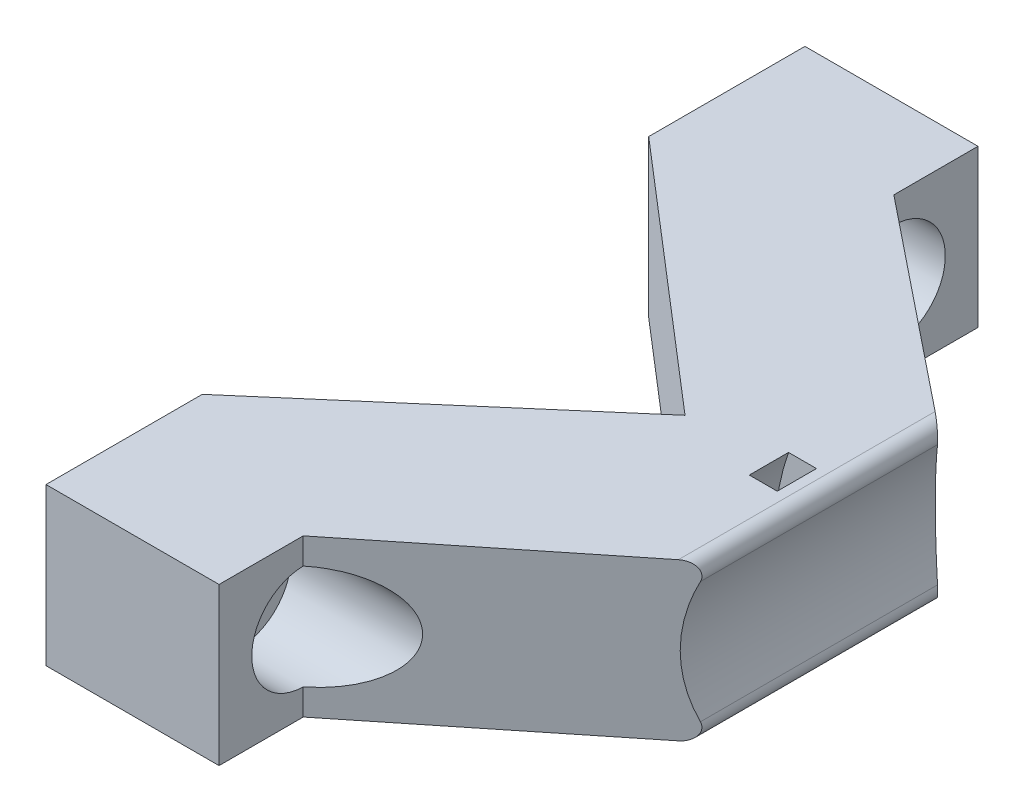
ISO-10303-21;
HEADER;
FILE_DESCRIPTION(('STEP AP214'),'2;1');
FILE_NAME('part.step','',(''),(''),'','','');
FILE_SCHEMA(('AUTOMOTIVE_DESIGN { 1 0 10303 214 1 1 1 1 }'));
ENDSEC;
DATA;
#1=APPLICATION_CONTEXT('core data for automotive mechanical design processes');
#2=APPLICATION_PROTOCOL_DEFINITION('international standard','automotive_design',2000,#1);
#3=PRODUCT_CONTEXT('',#1,'mechanical');
#4=PRODUCT('Part','Part','',(#3));
#5=PRODUCT_RELATED_PRODUCT_CATEGORY('part','',(#4));
#6=PRODUCT_DEFINITION_FORMATION('','',#4);
#7=PRODUCT_DEFINITION_CONTEXT('part definition',#1,'design');
#8=PRODUCT_DEFINITION('design','',#6,#7);
#9=PRODUCT_DEFINITION_SHAPE('','',#8);
#10=(LENGTH_UNIT() NAMED_UNIT(*) SI_UNIT(.MILLI.,.METRE.));
#11=(NAMED_UNIT(*) PLANE_ANGLE_UNIT() SI_UNIT($,.RADIAN.));
#12=(NAMED_UNIT(*) SI_UNIT($,.STERADIAN.) SOLID_ANGLE_UNIT());
#13=UNCERTAINTY_MEASURE_WITH_UNIT(LENGTH_MEASURE(1.E-05),#10,'distance_accuracy_value','');
#14=(GEOMETRIC_REPRESENTATION_CONTEXT(3) GLOBAL_UNCERTAINTY_ASSIGNED_CONTEXT((#13)) GLOBAL_UNIT_ASSIGNED_CONTEXT((#10,
#11,#12)) REPRESENTATION_CONTEXT('',''));
#15=CARTESIAN_POINT('',(0.,0.,0.));
#16=DIRECTION('',(0.,0.,1.));
#17=DIRECTION('',(1.,0.,0.));
#18=AXIS2_PLACEMENT_3D('',#15,#16,#17);
#19=CARTESIAN_POINT('',(106.173207801946,226.349685170106,344.272034703765));
#20=DIRECTION('',(0.,0.,1.));
#21=DIRECTION('',(0.823754471047907,0.566946709513852,0.));
#22=AXIS2_PLACEMENT_3D('',#19,#20,#21);
#23=CYLINDRICAL_SURFACE('',#22,1.);
#24=CARTESIAN_POINT('',(106.173207801946,226.349685170106,376.587161111501));
#25=DIRECTION('',(-0.625547510035263,0.,-0.780186075682387));
#26=DIRECTION('',(0.780186075682387,0.,-0.625547510035263));
#27=AXIS2_PLACEMENT_3D('',#24,#25,#26);
#28=ELLIPSE('',#27,1.28174551067879,1.);
#29=CARTESIAN_POINT('',(106.173207801946,227.349685170106,376.587161111501));
#30=VERTEX_POINT('',#29);
#31=CARTESIAN_POINT('',(107.107257575562,225.992542312963,375.838246809713));
#32=VERTEX_POINT('',#31);
#33=EDGE_CURVE('E11',#30,#32,#28,.T.);
#34=ORIENTED_EDGE('',*,*,#33,.T.);
#35=DIRECTION('',(0.,0.,-1.));
#36=VECTOR('',#35,1.);
#37=CARTESIAN_POINT('',(107.107257575562,225.992542312964,344.272034703765));
#38=LINE('',#37,#36);
#39=CARTESIAN_POINT('',(107.107257575562,225.992542312963,357.705822597817));
#40=VERTEX_POINT('',#39);
#41=EDGE_CURVE('E27',#32,#40,#38,.T.);
#42=ORIENTED_EDGE('',*,*,#41,.T.);
#43=CARTESIAN_POINT('',(106.173207801946,226.349685170106,356.956908296029));
#44=DIRECTION('',(-0.625547510035263,0.,0.780186075682387));
#45=DIRECTION('',(0.780186075682387,0.,0.625547510035263));
#46=AXIS2_PLACEMENT_3D('',#43,#44,#45);
#47=ELLIPSE('',#46,1.28174551067879,1.);
#48=CARTESIAN_POINT('',(106.173207801946,227.349685170106,356.956908296029));
#49=VERTEX_POINT('',#48);
#50=EDGE_CURVE('E318',#40,#49,#47,.T.);
#51=ORIENTED_EDGE('',*,*,#50,.T.);
#52=DIRECTION('',(0.,0.,1.));
#53=VECTOR('',#52,1.);
#54=CARTESIAN_POINT('',(106.173207801946,227.349685170106,344.272034703765));
#55=LINE('',#54,#53);
#56=EDGE_CURVE('E315',#49,#30,#55,.T.);
#57=ORIENTED_EDGE('',*,*,#56,.T.);
#58=EDGE_LOOP('',(#34,#42,#51,#57));
#59=FACE_BOUND('',#58,.T.);
#60=ADVANCED_FACE('F17',(#59),#23,.T.);
#61=CARTESIAN_POINT('',(84.2499060058593,227.349685170106,389.790902709961));
#62=DIRECTION('',(0.,1.,0.));
#63=DIRECTION('',(1.,0.,0.));
#64=AXIS2_PLACEMENT_3D('',#61,#62,#63);
#65=PLANE('',#64);
#66=DIRECTION('',(0.,0.,-1.));
#67=VECTOR('',#66,1.);
#68=CARTESIAN_POINT('',(103.279341884091,227.349685170106,375.272079467773));
#69=LINE('',#68,#67);
#70=CARTESIAN_POINT('',(103.279341884091,227.349685170106,368.272079467773));
#71=VERTEX_POINT('',#70);
#72=CARTESIAN_POINT('',(103.279341884091,227.349685170106,365.272079467773));
#73=VERTEX_POINT('',#72);
#74=EDGE_CURVE('E312',#71,#73,#69,.T.);
#75=ORIENTED_EDGE('',*,*,#74,.T.);
#76=DIRECTION('',(1.,0.,0.));
#77=VECTOR('',#76,1.);
#78=CARTESIAN_POINT('',(102.249905319214,227.349685170106,365.272079467773));
#79=LINE('',#78,#77);
#80=CARTESIAN_POINT('',(105.417507658377,227.349685170106,365.272079467773));
#81=VERTEX_POINT('',#80);
#82=EDGE_CURVE('E309',#73,#81,#79,.T.);
#83=ORIENTED_EDGE('',*,*,#82,.T.);
#84=DIRECTION('',(0.,0.,1.));
#85=VECTOR('',#84,1.);
#86=CARTESIAN_POINT('',(105.417507658377,227.349685170106,360.272079467773));
#87=LINE('',#86,#85);
#88=CARTESIAN_POINT('',(105.417507658377,227.349685170106,368.272079467773));
#89=VERTEX_POINT('',#88);
#90=EDGE_CURVE('E306',#81,#89,#87,.T.);
#91=ORIENTED_EDGE('',*,*,#90,.T.);
#92=DIRECTION('',(-1.,0.,0.));
#93=VECTOR('',#92,1.);
#94=CARTESIAN_POINT('',(102.249905319214,227.349685170106,368.272079467773));
#95=LINE('',#94,#93);
#96=EDGE_CURVE('E304',#89,#71,#95,.T.);
#97=ORIENTED_EDGE('',*,*,#96,.T.);
#98=EDGE_LOOP('',(#75,#83,#91,#97));
#99=FACE_BOUND('',#98,.T.);
#100=ORIENTED_EDGE('',*,*,#56,.F.);
#101=DIRECTION('',(-0.780186075682386,0.,-0.625547510035263));
#102=VECTOR('',#101,1.);
#103=CARTESIAN_POINT('',(103.211273527654,227.349685170106,354.582050979393));
#104=LINE('',#103,#102);
#105=CARTESIAN_POINT('',(90.2499060058594,227.349685170106,344.18972095374));
#106=VERTEX_POINT('',#105);
#107=EDGE_CURVE('E301',#49,#106,#104,.T.);
#108=ORIENTED_EDGE('',*,*,#107,.T.);
#109=DIRECTION('',(0.,0.,-1.));
#110=VECTOR('',#109,1.);
#111=CARTESIAN_POINT('',(90.2499060058593,227.349685170106,367.772057342529));
#112=LINE('',#111,#110);
#113=CARTESIAN_POINT('',(90.2499060058594,227.349685170106,337.753211975098));
#114=VERTEX_POINT('',#113);
#115=EDGE_CURVE('E298',#106,#114,#112,.T.);
#116=ORIENTED_EDGE('',*,*,#115,.T.);
#117=DIRECTION('',(-1.,0.,0.));
#118=VECTOR('',#117,1.);
#119=CARTESIAN_POINT('',(84.9702899169922,227.349685170106,337.753211975098));
#120=LINE('',#119,#118);
#121=CARTESIAN_POINT('',(77.0156779829498,227.349685170106,337.753211975098));
#122=VERTEX_POINT('',#121);
#123=EDGE_CURVE('E295',#114,#122,#120,.T.);
#124=ORIENTED_EDGE('',*,*,#123,.T.);
#125=DIRECTION('',(0.,0.,1.));
#126=VECTOR('',#125,1.);
#127=CARTESIAN_POINT('',(77.0156779829498,227.349685170106,384.272034703765));
#128=LINE('',#127,#126);
#129=CARTESIAN_POINT('',(77.0156779829498,227.349685170106,349.701806461646));
#130=VERTEX_POINT('',#129);
#131=EDGE_CURVE('E290',#122,#130,#128,.T.);
#132=ORIENTED_EDGE('',*,*,#131,.T.);
#133=DIRECTION('',(-0.758183249338418,0.,-0.652041532743612));
#134=VECTOR('',#133,1.);
#135=CARTESIAN_POINT('',(98.9957948588181,227.349685170106,368.604821148572));
#136=LINE('',#135,#134);
#137=CARTESIAN_POINT('',(96.8646607020417,227.349685170106,366.772034703765));
#138=VERTEX_POINT('',#137);
#139=EDGE_CURVE('E212',#138,#130,#136,.T.);
#140=ORIENTED_EDGE('',*,*,#139,.F.);
#141=DIRECTION('',(0.758183249338418,0.,-0.652041532743612));
#142=VECTOR('',#141,1.);
#143=CARTESIAN_POINT('',(87.6160268758223,227.349685170106,374.725907835484));
#144=LINE('',#143,#142);
#145=CARTESIAN_POINT('',(77.0156779829498,227.349685170106,383.842262945884));
#146=VERTEX_POINT('',#145);
#147=EDGE_CURVE('E166',#146,#138,#144,.T.);
#148=ORIENTED_EDGE('',*,*,#147,.F.);
#149=DIRECTION('',(0.,0.,1.));
#150=VECTOR('',#149,1.);
#151=CARTESIAN_POINT('',(77.0156779829498,227.349685170106,372.290902709961));
#152=LINE('',#151,#150);
#153=CARTESIAN_POINT('',(77.0156779829498,227.349685170106,395.790857432433));
#154=VERTEX_POINT('',#153);
#155=EDGE_CURVE('E287',#146,#154,#152,.T.);
#156=ORIENTED_EDGE('',*,*,#155,.T.);
#157=DIRECTION('',(1.,0.,0.));
#158=VECTOR('',#157,1.);
#159=CARTESIAN_POINT('',(84.9702899169922,227.349685170106,395.790857432433));
#160=LINE('',#159,#158);
#161=CARTESIAN_POINT('',(90.2499060058594,227.349685170106,395.790857432433));
#162=VERTEX_POINT('',#161);
#163=EDGE_CURVE('E283',#154,#162,#160,.T.);
#164=ORIENTED_EDGE('',*,*,#163,.T.);
#165=DIRECTION('',(0.,0.,1.));
#166=VECTOR('',#165,1.);
#167=CARTESIAN_POINT('',(90.2499060058594,227.349685170106,388.790880071197));
#168=LINE('',#167,#166);
#169=CARTESIAN_POINT('',(90.2499060058594,227.349685170106,389.35434845379));
#170=VERTEX_POINT('',#169);
#171=EDGE_CURVE('E169',#170,#162,#168,.T.);
#172=ORIENTED_EDGE('',*,*,#171,.F.);
#173=DIRECTION('',(0.780186075682387,0.,-0.625547510035263));
#174=VECTOR('',#173,1.);
#175=CARTESIAN_POINT('',(91.9770656095151,227.349685170106,387.969524469903));
#176=LINE('',#175,#174);
#177=EDGE_CURVE('E280',#170,#30,#176,.T.);
#178=ORIENTED_EDGE('',*,*,#177,.T.);
#179=EDGE_LOOP('',(#100,#108,#116,#124,#132,#140,#148,#156,#164,#172,#178));
#180=FACE_BOUND('',#179,.T.);
#181=ADVANCED_FACE('F331',(#99,#180),#65,.T.);
#182=CARTESIAN_POINT('',(97.5694245376556,221.77793071454,350.058457573036));
#183=DIRECTION('',(-0.625547510035263,0.,0.780186075682387));
#184=DIRECTION('',(0.,1.,0.));
#185=AXIS2_PLACEMENT_3D('',#182,#183,#184);
#186=PLANE('',#185);
#187=ORIENTED_EDGE('',*,*,#50,.F.);
#188=CARTESIAN_POINT('',(119.249904632568,221.349685170106,367.441708521061));
#189=DIRECTION('',(-0.625547510035263,0.,0.780186075682387));
#190=DIRECTION('',(-0.780186075682387,0.,-0.625547510035263));
#191=AXIS2_PLACEMENT_3D('',#188,#189,#190);
#192=ELLIPSE('',#191,16.6626916388242,13.);
#193=CARTESIAN_POINT('',(107.107257575562,216.706828027249,357.705822597817));
#194=VERTEX_POINT('',#193);
#195=EDGE_CURVE('E271',#40,#194,#192,.T.);
#196=ORIENTED_EDGE('',*,*,#195,.T.);
#197=CARTESIAN_POINT('',(106.173207801946,216.349685170106,356.956908296029));
#198=DIRECTION('',(-0.625547510035263,0.,0.780186075682387));
#199=DIRECTION('',(0.780186075682387,0.,0.625547510035263));
#200=AXIS2_PLACEMENT_3D('',#197,#198,#199);
#201=ELLIPSE('',#200,1.28174551067879,1.);
#202=CARTESIAN_POINT('',(106.173207801946,215.349685170106,356.956908296029));
#203=VERTEX_POINT('',#202);
#204=EDGE_CURVE('E264',#203,#194,#201,.T.);
#205=ORIENTED_EDGE('',*,*,#204,.F.);
#206=DIRECTION('',(0.780186075682387,0.,0.625547510035263));
#207=VECTOR('',#206,1.);
#208=CARTESIAN_POINT('',(103.211273527654,215.349685170106,354.582050979393));
#209=LINE('',#208,#207);
#210=CARTESIAN_POINT('',(90.2499060058594,215.349685170106,344.18972095374));
#211=VERTEX_POINT('',#210);
#212=EDGE_CURVE('E242',#211,#203,#209,.T.);
#213=ORIENTED_EDGE('',*,*,#212,.F.);
#214=DIRECTION('',(0.,-1.,0.));
#215=VECTOR('',#214,1.);
#216=CARTESIAN_POINT('',(90.2499060058594,221.992053486757,344.18972095374));
#217=LINE('',#216,#215);
#218=CARTESIAN_POINT('',(90.2499060058594,217.350189090572,344.18972095374));
#219=VERTEX_POINT('',#218);
#220=EDGE_CURVE('E195',#219,#211,#217,.T.);
#221=ORIENTED_EDGE('',*,*,#220,.F.);
#222=CARTESIAN_POINT('',(90.3290923346346,221.349685170106,344.253211975098));
#223=DIRECTION('',(0.625547510035263,0.,-0.780186075682387));
#224=DIRECTION('',(0.780186075682387,0.,0.625547510035263));
#225=AXIS2_PLACEMENT_3D('',#222,#223,#224);
#226=ELLIPSE('',#225,6.39439840432668,4.);
#227=CARTESIAN_POINT('',(90.2499060058594,225.34918124964,344.18972095374));
#228=VERTEX_POINT('',#227);
#229=EDGE_CURVE('E189',#228,#219,#226,.T.);
#230=ORIENTED_EDGE('',*,*,#229,.F.);
#231=DIRECTION('',(0.,-1.,0.));
#232=VECTOR('',#231,1.);
#233=CARTESIAN_POINT('',(90.2499060058594,221.992053486757,344.18972095374));
#234=LINE('',#233,#232);
#235=EDGE_CURVE('E194',#106,#228,#234,.T.);
#236=ORIENTED_EDGE('',*,*,#235,.F.);
#237=ORIENTED_EDGE('',*,*,#107,.F.);
#238=EDGE_LOOP('',(#187,#196,#205,#213,#221,#230,#236,#237));
#239=FACE_BOUND('',#238,.T.);
#240=ADVANCED_FACE('F327',(#239),#186,.F.);
#241=CARTESIAN_POINT('',(106.173207801946,216.349685170106,344.272034703765));
#242=DIRECTION('',(0.,0.,1.));
#243=DIRECTION('',(0.823754471047907,-0.566946709513852,0.));
#244=AXIS2_PLACEMENT_3D('',#241,#242,#243);
#245=CYLINDRICAL_SURFACE('',#244,1.);
#246=CARTESIAN_POINT('',(106.173207801946,216.349685170106,376.587161111502));
#247=DIRECTION('',(-0.625547510035263,0.,-0.780186075682387));
#248=DIRECTION('',(0.780186075682387,0.,-0.625547510035263));
#249=AXIS2_PLACEMENT_3D('',#246,#247,#248);
#250=ELLIPSE('',#249,1.28174551067879,1.);
#251=CARTESIAN_POINT('',(107.107257575562,216.706828027249,375.838246809713));
#252=VERTEX_POINT('',#251);
#253=CARTESIAN_POINT('',(106.173207801946,215.349685170106,376.587161111501));
#254=VERTEX_POINT('',#253);
#255=EDGE_CURVE('E268',#252,#254,#250,.T.);
#256=ORIENTED_EDGE('',*,*,#255,.T.);
#257=DIRECTION('',(0.,0.,-1.));
#258=VECTOR('',#257,1.);
#259=CARTESIAN_POINT('',(106.173207801946,215.349685170106,344.272034703765));
#260=LINE('',#259,#258);
#261=EDGE_CURVE('E265',#254,#203,#260,.T.);
#262=ORIENTED_EDGE('',*,*,#261,.T.);
#263=ORIENTED_EDGE('',*,*,#204,.T.);
#264=DIRECTION('',(0.,0.,1.));
#265=VECTOR('',#264,1.);
#266=CARTESIAN_POINT('',(107.107257575562,216.706828027249,344.272034703765));
#267=LINE('',#266,#265);
#268=EDGE_CURVE('E262',#194,#252,#267,.T.);
#269=ORIENTED_EDGE('',*,*,#268,.T.);
#270=EDGE_LOOP('',(#256,#262,#263,#269));
#271=FACE_BOUND('',#270,.T.);
#272=ADVANCED_FACE('F334',(#271),#245,.T.);
#273=CARTESIAN_POINT('',(84.2499060058593,215.349685170106,389.790902709961));
#274=DIRECTION('',(0.,1.,0.));
#275=DIRECTION('',(1.,0.,0.));
#276=AXIS2_PLACEMENT_3D('',#273,#274,#275);
#277=PLANE('',#276);
#278=ORIENTED_EDGE('',*,*,#261,.F.);
#279=DIRECTION('',(-0.780186075682387,0.,0.625547510035263));
#280=VECTOR('',#279,1.);
#281=CARTESIAN_POINT('',(91.9770656095151,215.349685170106,387.969524469903));
#282=LINE('',#281,#280);
#283=CARTESIAN_POINT('',(90.2499060058594,215.349685170106,389.35434845379));
#284=VERTEX_POINT('',#283);
#285=EDGE_CURVE('E260',#254,#284,#282,.T.);
#286=ORIENTED_EDGE('',*,*,#285,.T.);
#287=DIRECTION('',(0.,0.,1.));
#288=VECTOR('',#287,1.);
#289=CARTESIAN_POINT('',(90.2499060058594,215.349685170106,388.790880071197));
#290=LINE('',#289,#288);
#291=CARTESIAN_POINT('',(90.2499060058594,215.349685170106,395.790857432433));
#292=VERTEX_POINT('',#291);
#293=EDGE_CURVE('E164',#284,#292,#290,.T.);
#294=ORIENTED_EDGE('',*,*,#293,.T.);
#295=DIRECTION('',(-1.,0.,0.));
#296=VECTOR('',#295,1.);
#297=CARTESIAN_POINT('',(84.9702899169922,215.349685170106,395.790857432433));
#298=LINE('',#297,#296);
#299=CARTESIAN_POINT('',(77.0156779829498,215.349685170106,395.790857432433));
#300=VERTEX_POINT('',#299);
#301=EDGE_CURVE('E256',#292,#300,#298,.T.);
#302=ORIENTED_EDGE('',*,*,#301,.T.);
#303=DIRECTION('',(0.,0.,-1.));
#304=VECTOR('',#303,1.);
#305=CARTESIAN_POINT('',(77.0156779829498,215.349685170106,372.290902709961));
#306=LINE('',#305,#304);
#307=CARTESIAN_POINT('',(77.0156779829498,215.349685170106,383.842262945884));
#308=VERTEX_POINT('',#307);
#309=EDGE_CURVE('E250',#300,#308,#306,.T.);
#310=ORIENTED_EDGE('',*,*,#309,.T.);
#311=DIRECTION('',(-0.758183249338418,0.,0.652041532743612));
#312=VECTOR('',#311,1.);
#313=CARTESIAN_POINT('',(87.6160268758223,215.349685170106,374.725907835484));
#314=LINE('',#313,#312);
#315=CARTESIAN_POINT('',(96.8646607020417,215.349685170106,366.772034703765));
#316=VERTEX_POINT('',#315);
#317=EDGE_CURVE('E181',#316,#308,#314,.T.);
#318=ORIENTED_EDGE('',*,*,#317,.F.);
#319=DIRECTION('',(0.758183249338418,0.,0.652041532743612));
#320=VECTOR('',#319,1.);
#321=CARTESIAN_POINT('',(98.9957948588181,215.349685170106,368.604821148572));
#322=LINE('',#321,#320);
#323=CARTESIAN_POINT('',(77.0156779829498,215.349685170106,349.701806461646));
#324=VERTEX_POINT('',#323);
#325=EDGE_CURVE('E213',#324,#316,#322,.T.);
#326=ORIENTED_EDGE('',*,*,#325,.F.);
#327=DIRECTION('',(0.,0.,-1.));
#328=VECTOR('',#327,1.);
#329=CARTESIAN_POINT('',(77.0156779829498,215.349685170106,384.272034703765));
#330=LINE('',#329,#328);
#331=CARTESIAN_POINT('',(77.0156779829498,215.349685170106,337.753211975098));
#332=VERTEX_POINT('',#331);
#333=EDGE_CURVE('E247',#324,#332,#330,.T.);
#334=ORIENTED_EDGE('',*,*,#333,.T.);
#335=DIRECTION('',(1.,0.,0.));
#336=VECTOR('',#335,1.);
#337=CARTESIAN_POINT('',(84.9702899169922,215.349685170106,337.753211975098));
#338=LINE('',#337,#336);
#339=CARTESIAN_POINT('',(90.2499060058594,215.349685170106,337.753211975098));
#340=VERTEX_POINT('',#339);
#341=EDGE_CURVE('E244',#332,#340,#338,.T.);
#342=ORIENTED_EDGE('',*,*,#341,.T.);
#343=DIRECTION('',(0.,0.,-1.));
#344=VECTOR('',#343,1.);
#345=CARTESIAN_POINT('',(90.2499060058593,215.349685170106,367.772057342529));
#346=LINE('',#345,#344);
#347=EDGE_CURVE('E202',#211,#340,#346,.T.);
#348=ORIENTED_EDGE('',*,*,#347,.F.);
#349=ORIENTED_EDGE('',*,*,#212,.T.);
#350=EDGE_LOOP('',(#278,#286,#294,#302,#310,#318,#326,#334,#342,#348,#349));
#351=FACE_BOUND('',#350,.T.);
#352=DIRECTION('',(0.,0.,1.));
#353=VECTOR('',#352,1.);
#354=CARTESIAN_POINT('',(103.279341884091,215.349685170106,375.272079467773));
#355=LINE('',#354,#353);
#356=CARTESIAN_POINT('',(103.279341884091,215.349685170106,365.272079467773));
#357=VERTEX_POINT('',#356);
#358=CARTESIAN_POINT('',(103.279341884091,215.349685170106,368.272079467773));
#359=VERTEX_POINT('',#358);
#360=EDGE_CURVE('E239',#357,#359,#355,.T.);
#361=ORIENTED_EDGE('',*,*,#360,.T.);
#362=DIRECTION('',(1.,0.,0.));
#363=VECTOR('',#362,1.);
#364=CARTESIAN_POINT('',(102.249905319214,215.349685170106,368.272079467773));
#365=LINE('',#364,#363);
#366=CARTESIAN_POINT('',(105.417507658377,215.349685170106,368.272079467773));
#367=VERTEX_POINT('',#366);
#368=EDGE_CURVE('E236',#359,#367,#365,.T.);
#369=ORIENTED_EDGE('',*,*,#368,.T.);
#370=DIRECTION('',(0.,0.,-1.));
#371=VECTOR('',#370,1.);
#372=CARTESIAN_POINT('',(105.417507658377,215.349685170106,360.272079467773));
#373=LINE('',#372,#371);
#374=CARTESIAN_POINT('',(105.417507658377,215.349685170106,365.272079467773));
#375=VERTEX_POINT('',#374);
#376=EDGE_CURVE('E233',#367,#375,#373,.T.);
#377=ORIENTED_EDGE('',*,*,#376,.T.);
#378=DIRECTION('',(-1.,0.,0.));
#379=VECTOR('',#378,1.);
#380=CARTESIAN_POINT('',(102.249905319214,215.349685170106,365.272079467773));
#381=LINE('',#380,#379);
#382=EDGE_CURVE('E229',#375,#357,#381,.T.);
#383=ORIENTED_EDGE('',*,*,#382,.T.);
#384=EDGE_LOOP('',(#361,#369,#377,#383));
#385=FACE_BOUND('',#384,.T.);
#386=ADVANCED_FACE('F336',(#351,#385),#277,.F.);
#387=CARTESIAN_POINT('',(119.249904632568,221.349685170106,344.272034703765));
#388=DIRECTION('',(0.,0.,1.));
#389=DIRECTION('',(0.,1.,0.));
#390=AXIS2_PLACEMENT_3D('',#387,#388,#389);
#391=CYLINDRICAL_SURFACE('',#390,13.);
#392=ORIENTED_EDGE('',*,*,#41,.F.);
#393=CARTESIAN_POINT('',(119.249904632568,221.349685170106,366.102360886469));
#394=DIRECTION('',(-0.625547510035263,0.,-0.780186075682387));
#395=DIRECTION('',(-0.780186075682387,0.,0.625547510035263));
#396=AXIS2_PLACEMENT_3D('',#393,#394,#395);
#397=ELLIPSE('',#396,16.6626916388242,13.);
#398=EDGE_CURVE('E220',#252,#32,#397,.T.);
#399=ORIENTED_EDGE('',*,*,#398,.F.);
#400=ORIENTED_EDGE('',*,*,#268,.F.);
#401=ORIENTED_EDGE('',*,*,#195,.F.);
#402=EDGE_LOOP('',(#392,#399,#400,#401));
#403=FACE_BOUND('',#402,.T.);
#404=ADVANCED_FACE('F324',(#403),#391,.F.);
#405=CARTESIAN_POINT('',(120.249904632568,221.349685170106,360.272079467773));
#406=DIRECTION('',(0.,0.,1.));
#407=DIRECTION('',(1.,0.,0.));
#408=AXIS2_PLACEMENT_3D('',#405,#406,#407);
#409=CYLINDRICAL_SURFACE('',#408,16.);
#410=ORIENTED_EDGE('',*,*,#376,.F.);
#411=CARTESIAN_POINT('',(120.249904632568,221.349685170106,368.272079467773));
#412=DIRECTION('',(0.,0.,-1.));
#413=DIRECTION('',(1.,0.,0.));
#414=AXIS2_PLACEMENT_3D('',#411,#412,#413);
#415=CIRCLE('',#414,16.);
#416=EDGE_CURVE('E226',#367,#89,#415,.T.);
#417=ORIENTED_EDGE('',*,*,#416,.T.);
#418=ORIENTED_EDGE('',*,*,#90,.F.);
#419=CARTESIAN_POINT('',(120.249904632568,221.349685170106,365.272079467773));
#420=DIRECTION('',(0.,0.,1.));
#421=DIRECTION('',(1.,0.,0.));
#422=AXIS2_PLACEMENT_3D('',#419,#420,#421);
#423=CIRCLE('',#422,16.);
#424=EDGE_CURVE('E223',#81,#375,#423,.T.);
#425=ORIENTED_EDGE('',*,*,#424,.T.);
#426=EDGE_LOOP('',(#410,#417,#418,#425));
#427=FACE_BOUND('',#426,.T.);
#428=ADVANCED_FACE('F375',(#427),#409,.T.);
#429=CARTESIAN_POINT('',(120.249904632568,221.349685170106,365.272079467773));
#430=DIRECTION('',(0.,0.,-1.));
#431=DIRECTION('',(-1.,0.,0.));
#432=AXIS2_PLACEMENT_3D('',#429,#430,#431);
#433=PLANE('',#432);
#434=ORIENTED_EDGE('',*,*,#382,.F.);
#435=ORIENTED_EDGE('',*,*,#424,.F.);
#436=ORIENTED_EDGE('',*,*,#82,.F.);
#437=CARTESIAN_POINT('',(120.249904632568,221.349685170106,365.272079467773));
#438=DIRECTION('',(0.,0.,-1.));
#439=DIRECTION('',(1.,0.,0.));
#440=AXIS2_PLACEMENT_3D('',#437,#438,#439);
#441=CIRCLE('',#440,18.);
#442=EDGE_CURVE('E219',#357,#73,#441,.T.);
#443=ORIENTED_EDGE('',*,*,#442,.F.);
#444=EDGE_LOOP('',(#434,#435,#436,#443));
#445=FACE_BOUND('',#444,.T.);
#446=ADVANCED_FACE('F378',(#445),#433,.F.);
#447=CARTESIAN_POINT('',(120.249904632568,221.349685170106,375.272079467773));
#448=DIRECTION('',(0.,0.,1.));
#449=DIRECTION('',(1.,0.,0.));
#450=AXIS2_PLACEMENT_3D('',#447,#448,#449);
#451=CYLINDRICAL_SURFACE('',#450,18.);
#452=ORIENTED_EDGE('',*,*,#360,.F.);
#453=ORIENTED_EDGE('',*,*,#442,.T.);
#454=ORIENTED_EDGE('',*,*,#74,.F.);
#455=CARTESIAN_POINT('',(120.249904632568,221.349685170106,368.272079467773));
#456=DIRECTION('',(0.,0.,1.));
#457=DIRECTION('',(1.,0.,0.));
#458=AXIS2_PLACEMENT_3D('',#455,#456,#457);
#459=CIRCLE('',#458,18.);
#460=EDGE_CURVE('E216',#71,#359,#459,.T.);
#461=ORIENTED_EDGE('',*,*,#460,.T.);
#462=EDGE_LOOP('',(#452,#453,#454,#461));
#463=FACE_BOUND('',#462,.T.);
#464=ADVANCED_FACE('F382',(#463),#451,.F.);
#465=CARTESIAN_POINT('',(120.249904632568,221.349685170106,368.272079467773));
#466=DIRECTION('',(0.,0.,1.));
#467=DIRECTION('',(1.,0.,0.));
#468=AXIS2_PLACEMENT_3D('',#465,#466,#467);
#469=PLANE('',#468);
#470=ORIENTED_EDGE('',*,*,#368,.F.);
#471=ORIENTED_EDGE('',*,*,#460,.F.);
#472=ORIENTED_EDGE('',*,*,#96,.F.);
#473=ORIENTED_EDGE('',*,*,#416,.F.);
#474=EDGE_LOOP('',(#470,#471,#472,#473));
#475=FACE_BOUND('',#474,.T.);
#476=ADVANCED_FACE('F386',(#475),#469,.F.);
#477=CARTESIAN_POINT('',(97.5694245376556,220.921439625673,383.485611834494));
#478=DIRECTION('',(-0.625547510035263,0.,-0.780186075682387));
#479=DIRECTION('',(0.,-1.,0.));
#480=AXIS2_PLACEMENT_3D('',#477,#478,#479);
#481=PLANE('',#480);
#482=ORIENTED_EDGE('',*,*,#33,.F.);
#483=ORIENTED_EDGE('',*,*,#177,.F.);
#484=DIRECTION('',(0.,1.,0.));
#485=VECTOR('',#484,1.);
#486=CARTESIAN_POINT('',(90.2499060058594,220.707316853456,389.35434845379));
#487=LINE('',#486,#485);
#488=CARTESIAN_POINT('',(90.2499060058594,225.34918124964,389.35434845379));
#489=VERTEX_POINT('',#488);
#490=EDGE_CURVE('E155',#489,#170,#487,.T.);
#491=ORIENTED_EDGE('',*,*,#490,.F.);
#492=CARTESIAN_POINT('',(90.3290923346346,221.349685170106,389.290857432433));
#493=DIRECTION('',(0.625547510035263,0.,0.780186075682387));
#494=DIRECTION('',(0.780186075682387,0.,-0.625547510035263));
#495=AXIS2_PLACEMENT_3D('',#492,#493,#494);
#496=ELLIPSE('',#495,6.39439840432668,4.);
#497=CARTESIAN_POINT('',(90.2499060058594,217.350189090573,389.35434845379));
#498=VERTEX_POINT('',#497);
#499=EDGE_CURVE('E144',#498,#489,#496,.T.);
#500=ORIENTED_EDGE('',*,*,#499,.F.);
#501=DIRECTION('',(0.,1.,0.));
#502=VECTOR('',#501,1.);
#503=CARTESIAN_POINT('',(90.2499060058594,220.707316853456,389.35434845379));
#504=LINE('',#503,#502);
#505=EDGE_CURVE('E152',#284,#498,#504,.T.);
#506=ORIENTED_EDGE('',*,*,#505,.F.);
#507=ORIENTED_EDGE('',*,*,#285,.F.);
#508=ORIENTED_EDGE('',*,*,#255,.F.);
#509=ORIENTED_EDGE('',*,*,#398,.T.);
#510=EDGE_LOOP('',(#482,#483,#491,#500,#506,#507,#508,#509));
#511=FACE_BOUND('',#510,.T.);
#512=ADVANCED_FACE('F150',(#511),#481,.F.);
#513=CARTESIAN_POINT('',(96.9986498279693,221.349685170106,366.887266048057));
#514=DIRECTION('',(-0.652041532743612,0.,0.758183249338418));
#515=DIRECTION('',(0.,-1.,0.));
#516=AXIS2_PLACEMENT_3D('',#513,#514,#515);
#517=PLANE('',#516);
#518=DIRECTION('',(0.,-1.,0.));
#519=VECTOR('',#518,1.);
#520=CARTESIAN_POINT('',(96.8646607020417,221.349685170106,366.772034703765));
#521=LINE('',#520,#519);
#522=EDGE_CURVE('E208',#138,#316,#521,.T.);
#523=ORIENTED_EDGE('',*,*,#522,.F.);
#524=ORIENTED_EDGE('',*,*,#139,.T.);
#525=DIRECTION('',(0.,-1.,0.));
#526=VECTOR('',#525,1.);
#527=CARTESIAN_POINT('',(77.0156779829498,221.349685170106,349.701806461646));
#528=LINE('',#527,#526);
#529=EDGE_CURVE('E209',#130,#324,#528,.T.);
#530=ORIENTED_EDGE('',*,*,#529,.T.);
#531=ORIENTED_EDGE('',*,*,#325,.T.);
#532=EDGE_LOOP('',(#523,#524,#530,#531));
#533=FACE_BOUND('',#532,.T.);
#534=ADVANCED_FACE('F393',(#533),#517,.T.);
#535=CARTESIAN_POINT('',(85.2499060058593,221.349685170106,344.253211975098));
#536=DIRECTION('',(-1.,0.,0.));
#537=DIRECTION('',(0.,-1.,0.));
#538=AXIS2_PLACEMENT_3D('',#535,#536,#537);
#539=PLANE('',#538);
#540=CARTESIAN_POINT('',(85.2499060058593,221.349685170106,344.253211975098));
#541=DIRECTION('',(1.,0.,0.));
#542=DIRECTION('',(0.,1.,0.));
#543=AXIS2_PLACEMENT_3D('',#540,#541,#542);
#544=CIRCLE('',#543,2.2);
#545=CARTESIAN_POINT('',(85.2499060058593,223.549685170106,344.253211975098));
#546=VERTEX_POINT('',#545);
#547=EDGE_CURVE('E198',#546,#546,#544,.T.);
#548=ORIENTED_EDGE('',*,*,#547,.F.);
#549=EDGE_LOOP('',(#548));
#550=FACE_BOUND('',#549,.T.);
#551=CARTESIAN_POINT('',(85.2499060058593,221.349685170106,344.253211975098));
#552=DIRECTION('',(-1.,0.,0.));
#553=DIRECTION('',(0.,1.,0.));
#554=AXIS2_PLACEMENT_3D('',#551,#552,#553);
#555=CIRCLE('',#554,4.);
#556=CARTESIAN_POINT('',(85.2499060058593,225.349685170106,344.253211975098));
#557=VERTEX_POINT('',#556);
#558=EDGE_CURVE('E203',#557,#557,#555,.T.);
#559=ORIENTED_EDGE('',*,*,#558,.F.);
#560=EDGE_LOOP('',(#559));
#561=FACE_BOUND('',#560,.T.);
#562=ADVANCED_FACE('F396',(#550,#561),#539,.F.);
#563=CARTESIAN_POINT('',(85.690673828125,222.206176258973,337.753211975098));
#564=DIRECTION('',(0.,0.,-1.));
#565=DIRECTION('',(1.,0.,0.));
#566=AXIS2_PLACEMENT_3D('',#563,#564,#565);
#567=PLANE('',#566);
#568=DIRECTION('',(0.,1.,0.));
#569=VECTOR('',#568,1.);
#570=CARTESIAN_POINT('',(90.2499060058594,222.206176258973,337.753211975098));
#571=LINE('',#570,#569);
#572=EDGE_CURVE('E199',#340,#114,#571,.T.);
#573=ORIENTED_EDGE('',*,*,#572,.F.);
#574=ORIENTED_EDGE('',*,*,#341,.F.);
#575=DIRECTION('',(0.,-1.,0.));
#576=VECTOR('',#575,1.);
#577=CARTESIAN_POINT('',(77.0156779829498,221.77793071454,337.753211975098));
#578=LINE('',#577,#576);
#579=EDGE_CURVE('E190',#122,#332,#578,.T.);
#580=ORIENTED_EDGE('',*,*,#579,.F.);
#581=ORIENTED_EDGE('',*,*,#123,.F.);
#582=EDGE_LOOP('',(#573,#574,#580,#581));
#583=FACE_BOUND('',#582,.T.);
#584=ADVANCED_FACE('F357',(#583),#567,.T.);
#585=CARTESIAN_POINT('',(90.2499060058594,222.206176258973,345.753211975098));
#586=DIRECTION('',(1.,0.,0.));
#587=DIRECTION('',(0.,0.,1.));
#588=AXIS2_PLACEMENT_3D('',#585,#586,#587);
#589=PLANE('',#588);
#590=ORIENTED_EDGE('',*,*,#235,.T.);
#591=CARTESIAN_POINT('',(90.2499060058594,221.349685170106,344.253211975098));
#592=DIRECTION('',(-1.,0.,0.));
#593=DIRECTION('',(0.,1.,0.));
#594=AXIS2_PLACEMENT_3D('',#591,#592,#593);
#595=CIRCLE('',#594,4.);
#596=EDGE_CURVE('E191',#228,#219,#595,.T.);
#597=ORIENTED_EDGE('',*,*,#596,.T.);
#598=ORIENTED_EDGE('',*,*,#220,.T.);
#599=ORIENTED_EDGE('',*,*,#347,.T.);
#600=ORIENTED_EDGE('',*,*,#572,.T.);
#601=ORIENTED_EDGE('',*,*,#115,.F.);
#602=EDGE_LOOP('',(#590,#597,#598,#599,#600,#601));
#603=FACE_BOUND('',#602,.T.);
#604=ADVANCED_FACE('F342',(#603),#589,.T.);
#605=CARTESIAN_POINT('',(92.2499060058593,221.349685170106,344.253211975098));
#606=DIRECTION('',(1.,0.,0.));
#607=DIRECTION('',(0.,1.,0.));
#608=AXIS2_PLACEMENT_3D('',#605,#606,#607);
#609=CYLINDRICAL_SURFACE('',#608,4.);
#610=ORIENTED_EDGE('',*,*,#558,.T.);
#611=EDGE_LOOP('',(#610));
#612=FACE_BOUND('',#611,.T.);
#613=ORIENTED_EDGE('',*,*,#596,.F.);
#614=ORIENTED_EDGE('',*,*,#229,.T.);
#615=EDGE_LOOP('',(#613,#614));
#616=FACE_BOUND('',#615,.T.);
#617=ADVANCED_FACE('F344',(#612,#616),#609,.F.);
#618=CARTESIAN_POINT('',(77.0156779829498,221.349685170106,378.753166697569));
#619=DIRECTION('',(-1.,0.,0.));
#620=DIRECTION('',(0.,-1.,0.));
#621=AXIS2_PLACEMENT_3D('',#618,#619,#620);
#622=PLANE('',#621);
#623=CARTESIAN_POINT('',(77.0156779829498,221.349685170106,344.253211975098));
#624=DIRECTION('',(1.,0.,0.));
#625=DIRECTION('',(0.,1.,0.));
#626=AXIS2_PLACEMENT_3D('',#623,#624,#625);
#627=CIRCLE('',#626,2.2);
#628=CARTESIAN_POINT('',(77.0156779829498,223.549685170106,344.253211975098));
#629=VERTEX_POINT('',#628);
#630=EDGE_CURVE('E186',#629,#629,#627,.T.);
#631=ORIENTED_EDGE('',*,*,#630,.T.);
#632=EDGE_LOOP('',(#631));
#633=FACE_BOUND('',#632,.T.);
#634=ORIENTED_EDGE('',*,*,#529,.F.);
#635=ORIENTED_EDGE('',*,*,#131,.F.);
#636=ORIENTED_EDGE('',*,*,#579,.T.);
#637=ORIENTED_EDGE('',*,*,#333,.F.);
#638=EDGE_LOOP('',(#634,#635,#636,#637));
#639=FACE_BOUND('',#638,.T.);
#640=ADVANCED_FACE('F346',(#633,#639),#622,.T.);
#641=CARTESIAN_POINT('',(88.2499060058594,221.349685170106,344.253211975098));
#642=DIRECTION('',(1.,0.,0.));
#643=DIRECTION('',(0.,1.,0.));
#644=AXIS2_PLACEMENT_3D('',#641,#642,#643);
#645=CYLINDRICAL_SURFACE('',#644,2.2);
#646=ORIENTED_EDGE('',*,*,#547,.T.);
#647=EDGE_LOOP('',(#646));
#648=FACE_BOUND('',#647,.T.);
#649=ORIENTED_EDGE('',*,*,#630,.F.);
#650=EDGE_LOOP('',(#649));
#651=FACE_BOUND('',#650,.T.);
#652=ADVANCED_FACE('F354',(#648,#651),#645,.F.);
#653=CARTESIAN_POINT('',(85.2499060058593,221.349685170106,389.290857432433));
#654=DIRECTION('',(-1.,0.,0.));
#655=DIRECTION('',(0.,1.,0.));
#656=AXIS2_PLACEMENT_3D('',#653,#654,#655);
#657=PLANE('',#656);
#658=CARTESIAN_POINT('',(85.2499060058593,221.349685170106,389.290857432433));
#659=DIRECTION('',(1.,0.,0.));
#660=DIRECTION('',(0.,-1.,0.));
#661=AXIS2_PLACEMENT_3D('',#658,#659,#660);
#662=CIRCLE('',#661,2.2);
#663=CARTESIAN_POINT('',(85.2499060058593,219.149685170106,389.290857432433));
#664=VERTEX_POINT('',#663);
#665=EDGE_CURVE('E175',#664,#664,#662,.T.);
#666=ORIENTED_EDGE('',*,*,#665,.F.);
#667=EDGE_LOOP('',(#666));
#668=FACE_BOUND('',#667,.T.);
#669=CARTESIAN_POINT('',(85.2499060058593,221.349685170106,389.290857432433));
#670=DIRECTION('',(-1.,0.,0.));
#671=DIRECTION('',(0.,-1.,0.));
#672=AXIS2_PLACEMENT_3D('',#669,#670,#671);
#673=CIRCLE('',#672,4.);
#674=CARTESIAN_POINT('',(85.2499060058593,217.349685170106,389.290857432433));
#675=VERTEX_POINT('',#674);
#676=EDGE_CURVE('E157',#675,#675,#673,.T.);
#677=ORIENTED_EDGE('',*,*,#676,.F.);
#678=EDGE_LOOP('',(#677));
#679=FACE_BOUND('',#678,.T.);
#680=ADVANCED_FACE('F429',(#668,#679),#657,.F.);
#681=CARTESIAN_POINT('',(96.9986498279693,221.349685170106,366.656803359473));
#682=DIRECTION('',(-0.652041532743612,0.,-0.758183249338418));
#683=DIRECTION('',(0.,1.,0.));
#684=AXIS2_PLACEMENT_3D('',#681,#682,#683);
#685=PLANE('',#684);
#686=ORIENTED_EDGE('',*,*,#522,.T.);
#687=ORIENTED_EDGE('',*,*,#317,.T.);
#688=DIRECTION('',(0.,1.,0.));
#689=VECTOR('',#688,1.);
#690=CARTESIAN_POINT('',(77.0156779829498,221.349685170106,383.842262945884));
#691=LINE('',#690,#689);
#692=EDGE_CURVE('E178',#308,#146,#691,.T.);
#693=ORIENTED_EDGE('',*,*,#692,.T.);
#694=ORIENTED_EDGE('',*,*,#147,.T.);
#695=EDGE_LOOP('',(#686,#687,#693,#694));
#696=FACE_BOUND('',#695,.T.);
#697=ADVANCED_FACE('F414',(#696),#685,.T.);
#698=CARTESIAN_POINT('',(85.690673828125,220.493194081239,395.790857432433));
#699=DIRECTION('',(0.,0.,1.));
#700=DIRECTION('',(1.,0.,0.));
#701=AXIS2_PLACEMENT_3D('',#698,#699,#700);
#702=PLANE('',#701);
#703=DIRECTION('',(0.,-1.,0.));
#704=VECTOR('',#703,1.);
#705=CARTESIAN_POINT('',(90.2499060058594,220.493194081239,395.790857432433));
#706=LINE('',#705,#704);
#707=EDGE_CURVE('E176',#162,#292,#706,.T.);
#708=ORIENTED_EDGE('',*,*,#707,.F.);
#709=ORIENTED_EDGE('',*,*,#163,.F.);
#710=DIRECTION('',(0.,1.,0.));
#711=VECTOR('',#710,1.);
#712=CARTESIAN_POINT('',(77.0156779829498,220.921439625673,395.790857432433));
#713=LINE('',#712,#711);
#714=EDGE_CURVE('E172',#300,#154,#713,.T.);
#715=ORIENTED_EDGE('',*,*,#714,.F.);
#716=ORIENTED_EDGE('',*,*,#301,.F.);
#717=EDGE_LOOP('',(#708,#709,#715,#716));
#718=FACE_BOUND('',#717,.T.);
#719=ADVANCED_FACE('F421',(#718),#702,.T.);
#720=CARTESIAN_POINT('',(90.2499060058594,220.493194081239,387.790857432433));
#721=DIRECTION('',(1.,0.,0.));
#722=DIRECTION('',(0.,0.,-1.));
#723=AXIS2_PLACEMENT_3D('',#720,#721,#722);
#724=PLANE('',#723);
#725=ORIENTED_EDGE('',*,*,#505,.T.);
#726=CARTESIAN_POINT('',(90.2499060058594,221.349685170106,389.290857432433));
#727=DIRECTION('',(-1.,0.,0.));
#728=DIRECTION('',(0.,-1.,0.));
#729=AXIS2_PLACEMENT_3D('',#726,#727,#728);
#730=CIRCLE('',#729,4.);
#731=EDGE_CURVE('E161',#498,#489,#730,.T.);
#732=ORIENTED_EDGE('',*,*,#731,.T.);
#733=ORIENTED_EDGE('',*,*,#490,.T.);
#734=ORIENTED_EDGE('',*,*,#171,.T.);
#735=ORIENTED_EDGE('',*,*,#707,.T.);
#736=ORIENTED_EDGE('',*,*,#293,.F.);
#737=EDGE_LOOP('',(#725,#732,#733,#734,#735,#736));
#738=FACE_BOUND('',#737,.T.);
#739=ADVANCED_FACE('F160',(#738),#724,.T.);
#740=CARTESIAN_POINT('',(92.2499060058593,221.349685170106,389.290857432433));
#741=DIRECTION('',(1.,0.,0.));
#742=DIRECTION('',(0.,-1.,0.));
#743=AXIS2_PLACEMENT_3D('',#740,#741,#742);
#744=CYLINDRICAL_SURFACE('',#743,4.);
#745=ORIENTED_EDGE('',*,*,#676,.T.);
#746=EDGE_LOOP('',(#745));
#747=FACE_BOUND('',#746,.T.);
#748=ORIENTED_EDGE('',*,*,#731,.F.);
#749=ORIENTED_EDGE('',*,*,#499,.T.);
#750=EDGE_LOOP('',(#748,#749));
#751=FACE_BOUND('',#750,.T.);
#752=ADVANCED_FACE('F168',(#747,#751),#744,.F.);
#753=CARTESIAN_POINT('',(77.0156779829498,221.349685170106,354.790902709961));
#754=DIRECTION('',(-1.,0.,0.));
#755=DIRECTION('',(0.,1.,0.));
#756=AXIS2_PLACEMENT_3D('',#753,#754,#755);
#757=PLANE('',#756);
#758=CARTESIAN_POINT('',(77.0156779829498,221.349685170106,389.290857432433));
#759=DIRECTION('',(1.,0.,0.));
#760=DIRECTION('',(0.,-1.,0.));
#761=AXIS2_PLACEMENT_3D('',#758,#759,#760);
#762=CIRCLE('',#761,2.2);
#763=CARTESIAN_POINT('',(77.0156779829498,219.149685170106,389.290857432433));
#764=VERTEX_POINT('',#763);
#765=EDGE_CURVE('E21',#764,#764,#762,.T.);
#766=ORIENTED_EDGE('',*,*,#765,.T.);
#767=EDGE_LOOP('',(#766));
#768=FACE_BOUND('',#767,.T.);
#769=ORIENTED_EDGE('',*,*,#692,.F.);
#770=ORIENTED_EDGE('',*,*,#309,.F.);
#771=ORIENTED_EDGE('',*,*,#714,.T.);
#772=ORIENTED_EDGE('',*,*,#155,.F.);
#773=EDGE_LOOP('',(#769,#770,#771,#772));
#774=FACE_BOUND('',#773,.T.);
#775=ADVANCED_FACE('F417',(#768,#774),#757,.T.);
#776=CARTESIAN_POINT('',(88.2499060058594,221.349685170106,389.290857432433));
#777=DIRECTION('',(1.,0.,0.));
#778=DIRECTION('',(0.,-1.,0.));
#779=AXIS2_PLACEMENT_3D('',#776,#777,#778);
#780=CYLINDRICAL_SURFACE('',#779,2.2);
#781=ORIENTED_EDGE('',*,*,#665,.T.);
#782=EDGE_LOOP('',(#781));
#783=FACE_BOUND('',#782,.T.);
#784=ORIENTED_EDGE('',*,*,#765,.F.);
#785=EDGE_LOOP('',(#784));
#786=FACE_BOUND('',#785,.T.);
#787=ADVANCED_FACE('F19',(#783,#786),#780,.F.);
#788=CLOSED_SHELL('',(#60,#181,#240,#272,#386,#404,#428,#446,#464,#476,#512,#534,#562,#584,#604,
#617,#640,#652,#680,#697,#719,#739,#752,#775,#787));
#789=MANIFOLD_SOLID_BREP('B1',#788);
#790=ADVANCED_BREP_SHAPE_REPRESENTATION('',(#18,#789),#14);
#791=SHAPE_DEFINITION_REPRESENTATION(#9,#790);
ENDSEC;
END-ISO-10303-21;
